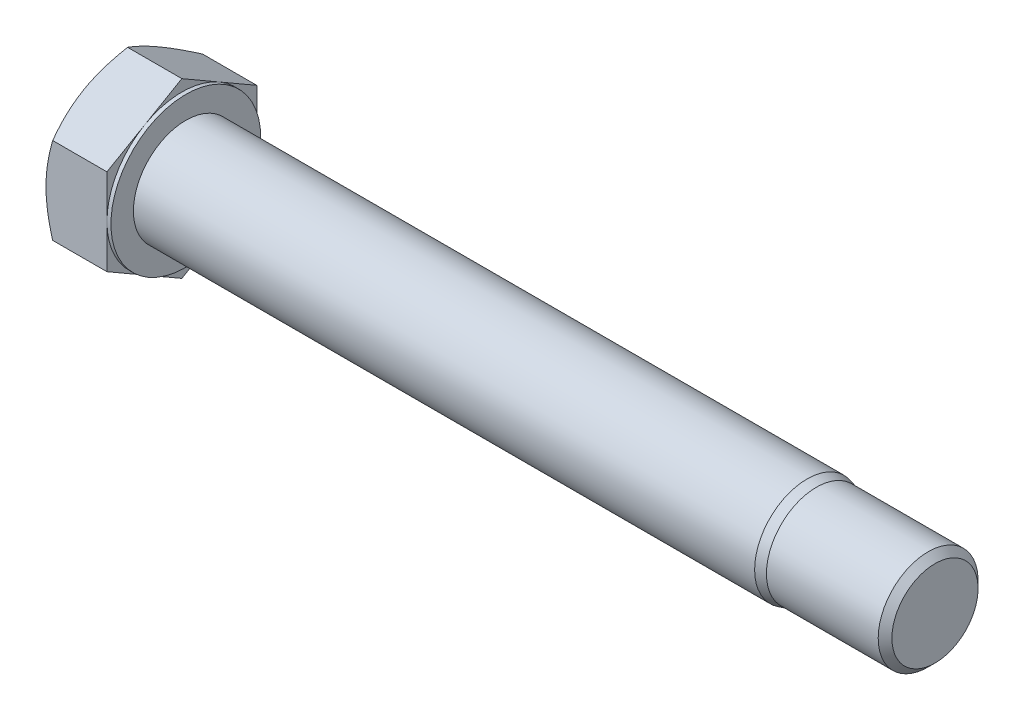
ISO-10303-21;
HEADER;
FILE_DESCRIPTION(('STEP AP214'),'2;1');
FILE_NAME('part.step','',(''),(''),'','','');
FILE_SCHEMA(('AUTOMOTIVE_DESIGN { 1 0 10303 214 1 1 1 1 }'));
ENDSEC;
DATA;
#1=APPLICATION_CONTEXT('core data for automotive mechanical design processes');
#2=APPLICATION_PROTOCOL_DEFINITION('international standard','automotive_design',2000,#1);
#3=PRODUCT_CONTEXT('',#1,'mechanical');
#4=PRODUCT('Part','Part','',(#3));
#5=PRODUCT_RELATED_PRODUCT_CATEGORY('part','',(#4));
#6=PRODUCT_DEFINITION_FORMATION('','',#4);
#7=PRODUCT_DEFINITION_CONTEXT('part definition',#1,'design');
#8=PRODUCT_DEFINITION('design','',#6,#7);
#9=PRODUCT_DEFINITION_SHAPE('','',#8);
#10=(LENGTH_UNIT() NAMED_UNIT(*) SI_UNIT(.MILLI.,.METRE.));
#11=(NAMED_UNIT(*) PLANE_ANGLE_UNIT() SI_UNIT($,.RADIAN.));
#12=(NAMED_UNIT(*) SI_UNIT($,.STERADIAN.) SOLID_ANGLE_UNIT());
#13=UNCERTAINTY_MEASURE_WITH_UNIT(LENGTH_MEASURE(1.E-05),#10,'distance_accuracy_value','');
#14=(GEOMETRIC_REPRESENTATION_CONTEXT(3) GLOBAL_UNCERTAINTY_ASSIGNED_CONTEXT((#13)) GLOBAL_UNIT_ASSIGNED_CONTEXT((#10,
#11,#12)) REPRESENTATION_CONTEXT('',''));
#15=CARTESIAN_POINT('',(0.,0.,0.));
#16=DIRECTION('',(0.,0.,1.));
#17=DIRECTION('',(1.,0.,0.));
#18=AXIS2_PLACEMENT_3D('',#15,#16,#17);
#19=CARTESIAN_POINT('',(13.,17.3205080756888,0.));
#20=DIRECTION('',(1.,0.,0.));
#21=DIRECTION('',(0.,0.,-1.));
#22=AXIS2_PLACEMENT_3D('',#19,#20,#21);
#23=PLANE('',#22);
#24=CARTESIAN_POINT('',(13.,0.,0.));
#25=DIRECTION('',(1.,0.,0.));
#26=DIRECTION('',(0.,0.,-1.));
#27=AXIS2_PLACEMENT_3D('',#24,#25,#26);
#28=CIRCLE('',#27,10.5);
#29=CARTESIAN_POINT('',(13.,0.,-10.5));
#30=VERTEX_POINT('',#29);
#31=EDGE_CURVE('E324',#30,#30,#28,.F.);
#32=ORIENTED_EDGE('',*,*,#31,.T.);
#33=EDGE_LOOP('',(#32));
#34=FACE_BOUND('',#33,.T.);
#35=CARTESIAN_POINT('',(13.,0.,0.));
#36=DIRECTION('',(1.,0.,0.));
#37=DIRECTION('',(0.,0.,-1.));
#38=AXIS2_PLACEMENT_3D('',#35,#36,#37);
#39=CIRCLE('',#38,15.);
#40=CARTESIAN_POINT('',(13.,0.,-15.));
#41=VERTEX_POINT('',#40);
#42=EDGE_CURVE('E337',#41,#41,#39,.T.);
#43=ORIENTED_EDGE('',*,*,#42,.T.);
#44=EDGE_LOOP('',(#43));
#45=FACE_BOUND('',#44,.T.);
#46=ADVANCED_FACE('F32',(#34,#45),#23,.T.);
#47=CARTESIAN_POINT('',(0.,0.,0.));
#48=DIRECTION('',(-1.,0.,0.));
#49=DIRECTION('',(0.,0.,1.));
#50=AXIS2_PLACEMENT_3D('',#47,#48,#49);
#51=CYLINDRICAL_SURFACE('',#50,10.5);
#52=ORIENTED_EDGE('',*,*,#31,.F.);
#53=EDGE_LOOP('',(#52));
#54=FACE_BOUND('',#53,.T.);
#55=CARTESIAN_POINT('',(137.383974596215,0.,0.));
#56=DIRECTION('',(-1.,0.,0.));
#57=DIRECTION('',(0.,0.,1.));
#58=AXIS2_PLACEMENT_3D('',#55,#56,#57);
#59=CIRCLE('',#58,10.5);
#60=CARTESIAN_POINT('',(137.383974596215,0.,10.5));
#61=VERTEX_POINT('',#60);
#62=EDGE_CURVE('E327',#61,#61,#59,.T.);
#63=ORIENTED_EDGE('',*,*,#62,.T.);
#64=EDGE_LOOP('',(#63));
#65=FACE_BOUND('',#64,.T.);
#66=ADVANCED_FACE('F241',(#54,#65),#51,.T.);
#67=CARTESIAN_POINT('',(139.25,0.,0.));
#68=DIRECTION('',(-1.,0.,0.));
#69=DIRECTION('',(0.,0.,1.));
#70=AXIS2_PLACEMENT_3D('',#67,#68,#69);
#71=CONICAL_SURFACE('',#70,9.99999999999999,0.261799387799145);
#72=ORIENTED_EDGE('',*,*,#62,.F.);
#73=EDGE_LOOP('',(#72));
#74=FACE_BOUND('',#73,.T.);
#75=CARTESIAN_POINT('',(139.25,0.,0.));
#76=DIRECTION('',(-1.,0.,0.));
#77=DIRECTION('',(0.,0.,1.));
#78=AXIS2_PLACEMENT_3D('',#75,#76,#77);
#79=CIRCLE('',#78,9.99999999999999);
#80=CARTESIAN_POINT('',(139.25,0.,9.99999999999999));
#81=VERTEX_POINT('',#80);
#82=EDGE_CURVE('E276',#81,#81,#79,.T.);
#83=ORIENTED_EDGE('',*,*,#82,.T.);
#84=EDGE_LOOP('',(#83));
#85=FACE_BOUND('',#84,.T.);
#86=ADVANCED_FACE('F246',(#74,#85),#71,.T.);
#87=CARTESIAN_POINT('',(0.,0.,0.));
#88=DIRECTION('',(-1.,0.,0.));
#89=DIRECTION('',(0.,0.,1.));
#90=AXIS2_PLACEMENT_3D('',#87,#88,#89);
#91=CYLINDRICAL_SURFACE('',#90,10.);
#92=ORIENTED_EDGE('',*,*,#82,.F.);
#93=EDGE_LOOP('',(#92));
#94=FACE_BOUND('',#93,.T.);
#95=CARTESIAN_POINT('',(161.626,0.,0.));
#96=DIRECTION('',(-1.,0.,0.));
#97=DIRECTION('',(0.,0.,1.));
#98=AXIS2_PLACEMENT_3D('',#95,#96,#97);
#99=CIRCLE('',#98,10.0000000000001);
#100=CARTESIAN_POINT('',(161.626,0.,10.0000000000001));
#101=VERTEX_POINT('',#100);
#102=EDGE_CURVE('E274',#101,#101,#99,.T.);
#103=ORIENTED_EDGE('',*,*,#102,.T.);
#104=EDGE_LOOP('',(#103));
#105=FACE_BOUND('',#104,.T.);
#106=ADVANCED_FACE('F254',(#94,#105),#91,.T.);
#107=CARTESIAN_POINT('',(163.,0.,0.));
#108=DIRECTION('',(-1.,0.,0.));
#109=DIRECTION('',(0.,0.,1.));
#110=AXIS2_PLACEMENT_3D('',#107,#108,#109);
#111=CONICAL_SURFACE('',#110,8.626,0.785398163397474);
#112=ORIENTED_EDGE('',*,*,#102,.F.);
#113=EDGE_LOOP('',(#112));
#114=FACE_BOUND('',#113,.T.);
#115=CARTESIAN_POINT('',(163.,0.,0.));
#116=DIRECTION('',(-1.,0.,0.));
#117=DIRECTION('',(0.,0.,1.));
#118=AXIS2_PLACEMENT_3D('',#115,#116,#117);
#119=CIRCLE('',#118,8.626);
#120=CARTESIAN_POINT('',(163.,0.,8.626));
#121=VERTEX_POINT('',#120);
#122=EDGE_CURVE('E228',#121,#121,#119,.T.);
#123=ORIENTED_EDGE('',*,*,#122,.T.);
#124=EDGE_LOOP('',(#123));
#125=FACE_BOUND('',#124,.T.);
#126=ADVANCED_FACE('F258',(#114,#125),#111,.T.);
#127=CARTESIAN_POINT('',(163.,0.,0.));
#128=DIRECTION('',(-1.,0.,0.));
#129=DIRECTION('',(0.,0.,1.));
#130=AXIS2_PLACEMENT_3D('',#127,#128,#129);
#131=PLANE('',#130);
#132=ORIENTED_EDGE('',*,*,#122,.F.);
#133=EDGE_LOOP('',(#132));
#134=FACE_BOUND('',#133,.T.);
#135=ADVANCED_FACE('F261',(#134),#131,.F.);
#136=CARTESIAN_POINT('',(12.2,15.,0.));
#137=DIRECTION('',(1.,0.,0.));
#138=DIRECTION('',(0.,0.,-1.));
#139=AXIS2_PLACEMENT_3D('',#136,#137,#138);
#140=PLANE('',#139);
#141=DIRECTION('',(0.,0.500000000000001,0.866025403784438));
#142=VECTOR('',#141,1.);
#143=CARTESIAN_POINT('',(12.2,8.66025403784438,-15.));
#144=LINE('',#143,#142);
#145=CARTESIAN_POINT('',(12.2,8.66025403784441,-15.));
#146=VERTEX_POINT('',#145);
#147=CARTESIAN_POINT('',(12.2,12.9903810567666,-7.50000000000002));
#148=VERTEX_POINT('',#147);
#149=EDGE_CURVE('E165',#146,#148,#144,.T.);
#150=ORIENTED_EDGE('',*,*,#149,.T.);
#151=CARTESIAN_POINT('',(12.2,0.,0.));
#152=DIRECTION('',(-1.,0.,0.));
#153=DIRECTION('',(0.,0.,1.));
#154=AXIS2_PLACEMENT_3D('',#151,#152,#153);
#155=CIRCLE('',#154,15.);
#156=CARTESIAN_POINT('',(12.2,0.,-15.));
#157=VERTEX_POINT('',#156);
#158=EDGE_CURVE('E48',#148,#157,#155,.T.);
#159=ORIENTED_EDGE('',*,*,#158,.T.);
#160=DIRECTION('',(0.,1.,0.));
#161=VECTOR('',#160,1.);
#162=CARTESIAN_POINT('',(12.2,8.66025403784438,-15.));
#163=LINE('',#162,#161);
#164=EDGE_CURVE('E37',#157,#146,#163,.T.);
#165=ORIENTED_EDGE('',*,*,#164,.T.);
#166=EDGE_LOOP('',(#150,#159,#165));
#167=FACE_BOUND('',#166,.T.);
#168=ADVANCED_FACE('F264',(#167),#140,.T.);
#169=CARTESIAN_POINT('',(12.2,17.3205080756888,0.));
#170=VERTEX_POINT('',#169);
#171=EDGE_CURVE('E163',#148,#170,#144,.T.);
#172=ORIENTED_EDGE('',*,*,#171,.T.);
#173=DIRECTION('',(0.,-0.500000000000001,0.866025403784438));
#174=VECTOR('',#173,1.);
#175=CARTESIAN_POINT('',(12.2,17.3205080756888,0.));
#176=LINE('',#175,#174);
#177=CARTESIAN_POINT('',(12.2,12.9903810567666,7.50000000000002));
#178=VERTEX_POINT('',#177);
#179=EDGE_CURVE('E162',#170,#178,#176,.T.);
#180=ORIENTED_EDGE('',*,*,#179,.T.);
#181=EDGE_CURVE('E151',#178,#148,#155,.T.);
#182=ORIENTED_EDGE('',*,*,#181,.T.);
#183=EDGE_LOOP('',(#172,#180,#182));
#184=FACE_BOUND('',#183,.T.);
#185=ADVANCED_FACE('F269',(#184),#140,.T.);
#186=CARTESIAN_POINT('',(12.2,8.66025403784441,15.));
#187=VERTEX_POINT('',#186);
#188=EDGE_CURVE('E130',#178,#187,#176,.T.);
#189=ORIENTED_EDGE('',*,*,#188,.T.);
#190=DIRECTION('',(0.,-1.,0.));
#191=VECTOR('',#190,1.);
#192=CARTESIAN_POINT('',(12.2,8.66025403784437,15.));
#193=LINE('',#192,#191);
#194=CARTESIAN_POINT('',(12.2,0.,15.));
#195=VERTEX_POINT('',#194);
#196=EDGE_CURVE('E124',#187,#195,#193,.T.);
#197=ORIENTED_EDGE('',*,*,#196,.T.);
#198=EDGE_CURVE('E128',#195,#178,#155,.T.);
#199=ORIENTED_EDGE('',*,*,#198,.T.);
#200=EDGE_LOOP('',(#189,#197,#199));
#201=FACE_BOUND('',#200,.T.);
#202=ADVANCED_FACE('F126',(#201),#140,.T.);
#203=CARTESIAN_POINT('',(12.2,-8.6602540378444,15.));
#204=VERTEX_POINT('',#203);
#205=EDGE_CURVE('E134',#195,#204,#193,.T.);
#206=ORIENTED_EDGE('',*,*,#205,.T.);
#207=DIRECTION('',(0.,-0.500000000000001,-0.866025403784438));
#208=VECTOR('',#207,1.);
#209=CARTESIAN_POINT('',(12.2,-17.3205080756888,0.));
#210=LINE('',#209,#208);
#211=CARTESIAN_POINT('',(12.2,-12.9903810567666,7.50000000000002));
#212=VERTEX_POINT('',#211);
#213=EDGE_CURVE('E141',#204,#212,#210,.T.);
#214=ORIENTED_EDGE('',*,*,#213,.T.);
#215=EDGE_CURVE('E138',#212,#195,#155,.T.);
#216=ORIENTED_EDGE('',*,*,#215,.T.);
#217=EDGE_LOOP('',(#206,#214,#216));
#218=FACE_BOUND('',#217,.T.);
#219=ADVANCED_FACE('F139',(#218),#140,.T.);
#220=CARTESIAN_POINT('',(12.2,-17.3205080756888,0.));
#221=VERTEX_POINT('',#220);
#222=EDGE_CURVE('E157',#212,#221,#210,.T.);
#223=ORIENTED_EDGE('',*,*,#222,.T.);
#224=DIRECTION('',(0.,0.5,-0.866025403784438));
#225=VECTOR('',#224,1.);
#226=CARTESIAN_POINT('',(12.2,-8.66025403784441,-15.));
#227=LINE('',#226,#225);
#228=CARTESIAN_POINT('',(12.2,-12.9903810567666,-7.50000000000001));
#229=VERTEX_POINT('',#228);
#230=EDGE_CURVE('E350',#221,#229,#227,.T.);
#231=ORIENTED_EDGE('',*,*,#230,.T.);
#232=EDGE_CURVE('E145',#229,#212,#155,.T.);
#233=ORIENTED_EDGE('',*,*,#232,.T.);
#234=EDGE_LOOP('',(#223,#231,#233));
#235=FACE_BOUND('',#234,.T.);
#236=ADVANCED_FACE('F352',(#235),#140,.T.);
#237=CARTESIAN_POINT('',(12.2,-8.6602540378444,-15.));
#238=VERTEX_POINT('',#237);
#239=EDGE_CURVE('E152',#229,#238,#227,.T.);
#240=ORIENTED_EDGE('',*,*,#239,.T.);
#241=EDGE_CURVE('E11',#238,#157,#163,.T.);
#242=ORIENTED_EDGE('',*,*,#241,.T.);
#243=EDGE_CURVE('E349',#157,#229,#155,.T.);
#244=ORIENTED_EDGE('',*,*,#243,.T.);
#245=EDGE_LOOP('',(#240,#242,#244));
#246=FACE_BOUND('',#245,.T.);
#247=ADVANCED_FACE('F270',(#246),#140,.T.);
#248=CARTESIAN_POINT('',(0.,0.,0.));
#249=DIRECTION('',(-1.,0.,0.));
#250=DIRECTION('',(0.,0.,1.));
#251=AXIS2_PLACEMENT_3D('',#248,#249,#250);
#252=CYLINDRICAL_SURFACE('',#251,15.);
#253=ORIENTED_EDGE('',*,*,#158,.F.);
#254=ORIENTED_EDGE('',*,*,#181,.F.);
#255=ORIENTED_EDGE('',*,*,#198,.F.);
#256=ORIENTED_EDGE('',*,*,#215,.F.);
#257=ORIENTED_EDGE('',*,*,#232,.F.);
#258=ORIENTED_EDGE('',*,*,#243,.F.);
#259=EDGE_LOOP('',(#253,#254,#255,#256,#257,#258));
#260=FACE_BOUND('',#259,.T.);
#261=ORIENTED_EDGE('',*,*,#42,.F.);
#262=EDGE_LOOP('',(#261));
#263=FACE_BOUND('',#262,.T.);
#264=ADVANCED_FACE('F148',(#260,#263),#252,.T.);
#265=CARTESIAN_POINT('',(0.,17.3205080756888,0.));
#266=DIRECTION('',(1.,0.,0.));
#267=DIRECTION('',(0.,0.,-1.));
#268=AXIS2_PLACEMENT_3D('',#265,#266,#267);
#269=PLANE('',#268);
#270=CARTESIAN_POINT('',(0.,0.,0.));
#271=DIRECTION('',(1.,0.,0.));
#272=DIRECTION('',(0.,0.,-1.));
#273=AXIS2_PLACEMENT_3D('',#270,#271,#272);
#274=CIRCLE('',#273,15.);
#275=CARTESIAN_POINT('',(0.,0.,-15.));
#276=VERTEX_POINT('',#275);
#277=CARTESIAN_POINT('',(0.,12.9903810567666,-7.50000000000001));
#278=VERTEX_POINT('',#277);
#279=EDGE_CURVE('E336',#276,#278,#274,.T.);
#280=ORIENTED_EDGE('',*,*,#279,.F.);
#281=CARTESIAN_POINT('',(0.,-12.9903810567666,-7.50000000000002));
#282=VERTEX_POINT('',#281);
#283=EDGE_CURVE('E335',#282,#276,#274,.T.);
#284=ORIENTED_EDGE('',*,*,#283,.F.);
#285=CARTESIAN_POINT('',(0.,-12.9903810567666,7.50000000000003));
#286=VERTEX_POINT('',#285);
#287=EDGE_CURVE('E294',#286,#282,#274,.T.);
#288=ORIENTED_EDGE('',*,*,#287,.F.);
#289=CARTESIAN_POINT('',(0.,0.,15.));
#290=VERTEX_POINT('',#289);
#291=EDGE_CURVE('E304',#290,#286,#274,.T.);
#292=ORIENTED_EDGE('',*,*,#291,.F.);
#293=CARTESIAN_POINT('',(0.,12.9903810567666,7.50000000000002));
#294=VERTEX_POINT('',#293);
#295=EDGE_CURVE('E312',#294,#290,#274,.T.);
#296=ORIENTED_EDGE('',*,*,#295,.F.);
#297=EDGE_CURVE('E317',#278,#294,#274,.T.);
#298=ORIENTED_EDGE('',*,*,#297,.F.);
#299=EDGE_LOOP('',(#280,#284,#288,#292,#296,#298));
#300=FACE_BOUND('',#299,.T.);
#301=ADVANCED_FACE('F192',(#300),#269,.F.);
#302=CARTESIAN_POINT('',(-3.75000000000003,0.,0.));
#303=DIRECTION('',(1.,0.,0.));
#304=DIRECTION('',(0.,0.,-1.));
#305=AXIS2_PLACEMENT_3D('',#302,#303,#304);
#306=CONICAL_SURFACE('',#305,8.50480947161672,1.04719755119659);
#307=CARTESIAN_POINT('',(1.33981262948896,17.3206235457426,0.0002));
#308=CARTESIAN_POINT('',(1.22992178974396,17.130274565913,-0.329494104233799));
#309=CARTESIAN_POINT('',(1.12501758932863,16.939183122782,-0.6604741926283));
#310=CARTESIAN_POINT('',(0.926568581943121,16.5554679079492,-1.32508844035602));
#311=CARTESIAN_POINT('',(0.83302751104951,16.3628436543362,-1.6587234343838));
#312=CARTESIAN_POINT('',(0.658562147609874,15.9756905506624,-2.32929228025473));
#313=CARTESIAN_POINT('',(0.5776677066022,15.7811583127512,-2.66623200002702));
#314=CARTESIAN_POINT('',(0.430232643422054,15.3907420734253,-3.34245276263939));
#315=CARTESIAN_POINT('',(0.363691202381335,15.1948581497855,-3.68173367076952));
#316=CARTESIAN_POINT('',(0.247792374696316,14.8067578304067,-4.35394314236732));
#317=CARTESIAN_POINT('',(0.198051383436672,14.6145702475688,-4.68682180042635));
#318=CARTESIAN_POINT('',(0.114646749003612,14.2293144416655,-5.3541044301617));
#319=CARTESIAN_POINT('',(0.0809834152900895,14.0362462017216,-5.6885084310725));
#320=CARTESIAN_POINT('',(0.0305840757080864,13.6497853945792,-6.35787818417716));
#321=CARTESIAN_POINT('',(0.0138279549580525,13.4563934876199,-6.69284279280336));
#322=CARTESIAN_POINT('',(-0.00239660617302037,13.0694311550724,-7.36308121339102));
#323=CARTESIAN_POINT('',(-0.00186558072757846,12.8758607351851,-7.69835501547826));
#324=CARTESIAN_POINT('',(0.015276612998169,12.5139822792559,-8.32514688731222));
#325=CARTESIAN_POINT('',(0.0297968460490158,12.3456484541475,-8.61670962503244));
#326=CARTESIAN_POINT('',(0.0716371404224131,12.0093680110861,-9.19916443800649));
#327=CARTESIAN_POINT('',(0.0989581071094781,11.8414214213658,-9.4900564643599));
#328=CARTESIAN_POINT('',(0.165923511998908,11.5060066717823,-10.0710118522466));
#329=CARTESIAN_POINT('',(0.205578128270666,11.338539022767,-10.3610743289652));
#330=CARTESIAN_POINT('',(0.296515103017909,11.0043888432043,-10.939839417326));
#331=CARTESIAN_POINT('',(0.347798251969264,10.8377063668174,-11.2285419351595));
#332=CARTESIAN_POINT('',(0.520386864747116,10.3317324659531,-12.1049144387604));
#333=CARTESIAN_POINT('',(0.658901178256939,9.99390625559024,-12.6900465992373));
#334=CARTESIAN_POINT('',(0.973271968475223,9.32329122184509,-13.8515859100034));
#335=CARTESIAN_POINT('',(1.14905461461789,8.99049381241394,-14.4280079317654));
#336=CARTESIAN_POINT('',(1.33981262948895,8.66013856779054,-15.0002));
#337=B_SPLINE_CURVE_WITH_KNOTS('',3,(#307,#308,#309,#310,#311,#312,#313,#314,#315,#316,#317,
#318,#319,#320,#321,#322,#323,#324,#325,#326,#327,#328,#329,#330,#331,#332,#333,#334,#335,#336),
.UNSPECIFIED.,.F.,.F.,(4,2,2,2,2,2,2,2,2,2,2,2,2,2,4),(0.,1.18875411504163,2.37789802800057,
3.56980778300396,4.76164951910137,5.9240737968376,7.08652044780813,8.2475824740608,
9.40860862348379,10.4193068498566,11.4300765712312,12.4416826308653,13.4533574773408,
15.5211962051185,17.5849760846241),.UNSPECIFIED.);
#338=CARTESIAN_POINT('',(1.33974596215563,17.3205080756888,0.));
#339=VERTEX_POINT('',#338);
#340=EDGE_CURVE('E56',#339,#278,#337,.T.);
#341=ORIENTED_EDGE('',*,*,#340,.T.);
#342=ORIENTED_EDGE('',*,*,#297,.T.);
#343=CARTESIAN_POINT('',(1.33981262948895,8.66013856779053,15.0002));
#344=CARTESIAN_POINT('',(1.22992178974395,8.85048754762015,14.6705058957662));
#345=CARTESIAN_POINT('',(1.12501758932862,9.04157899075112,14.3395258073717));
#346=CARTESIAN_POINT('',(0.926568581943112,9.42529420558398,13.674911559644));
#347=CARTESIAN_POINT('',(0.8330275110495,9.617918459197,13.3412765656162));
#348=CARTESIAN_POINT('',(0.658562147609866,10.0050715628708,12.6707077197453));
#349=CARTESIAN_POINT('',(0.577667706602194,10.199603800782,12.333767999973));
#350=CARTESIAN_POINT('',(0.430232643422049,10.5900200401078,11.6575472373606));
#351=CARTESIAN_POINT('',(0.363691202381331,10.7859039637477,11.3182663292305));
#352=CARTESIAN_POINT('',(0.247792374696311,11.1740042831265,10.6460568576327));
#353=CARTESIAN_POINT('',(0.198051383436668,11.3661918659643,10.3131781995737));
#354=CARTESIAN_POINT('',(0.114646749003609,11.7514476718676,9.6458955698383));
#355=CARTESIAN_POINT('',(0.0809834152900879,11.9445159118115,9.3114915689275));
#356=CARTESIAN_POINT('',(0.0305840757080845,12.3309767189539,8.64212181582284));
#357=CARTESIAN_POINT('',(0.0138279549580492,12.5243686259132,8.30715720719664));
#358=CARTESIAN_POINT('',(-0.00239660617302328,12.9113309584608,7.63691878660899));
#359=CARTESIAN_POINT('',(-0.00186558072757963,13.1049013783481,7.30164498452175));
#360=CARTESIAN_POINT('',(0.0152766129981692,13.4667798342773,6.67485311268779));
#361=CARTESIAN_POINT('',(0.029796846049016,13.6351136593857,6.38329037496757));
#362=CARTESIAN_POINT('',(0.0716371404224139,13.9713941024471,5.80083556199351));
#363=CARTESIAN_POINT('',(0.0989581071094796,14.1393406921673,5.5099435356401));
#364=CARTESIAN_POINT('',(0.16592351199891,14.4747554417509,4.92898814775337));
#365=CARTESIAN_POINT('',(0.205578128270668,14.6422230907662,4.63892567103481));
#366=CARTESIAN_POINT('',(0.296515103017912,14.9763732703289,4.06016058267396));
#367=CARTESIAN_POINT('',(0.347798251969267,15.1430557467158,3.77145806484046));
#368=CARTESIAN_POINT('',(0.52038686474712,15.6490296475801,2.89508556123959));
#369=CARTESIAN_POINT('',(0.658901178256944,15.9868558579429,2.30995340076274));
#370=CARTESIAN_POINT('',(0.973271968475231,16.6574708916881,1.14841408999664));
#371=CARTESIAN_POINT('',(1.1490546146179,16.9902683011192,0.571992068234583));
#372=CARTESIAN_POINT('',(1.33981262948896,17.3206235457426,-0.000200000000000835));
#373=B_SPLINE_CURVE_WITH_KNOTS('',3,(#343,#344,#345,#346,#347,#348,#349,#350,#351,#352,#353,
#354,#355,#356,#357,#358,#359,#360,#361,#362,#363,#364,#365,#366,#367,#368,#369,#370,#371,#372),
.UNSPECIFIED.,.F.,.F.,(4,2,2,2,2,2,2,2,2,2,2,2,2,2,4),(0.,1.18875411504163,2.37789802800057,
3.56980778300395,4.76164951910137,5.92407379683759,7.08652044780813,8.24758247406079,
9.40860862348378,10.4193068498566,11.4300765712312,12.4416826308653,13.4533574773408,
15.5211962051185,17.5849760846241),.UNSPECIFIED.);
#374=EDGE_CURVE('E227',#294,#339,#373,.T.);
#375=ORIENTED_EDGE('',*,*,#374,.T.);
#376=EDGE_LOOP('',(#341,#342,#375));
#377=FACE_BOUND('',#376,.T.);
#378=ADVANCED_FACE('F181',(#377),#306,.T.);
#379=CARTESIAN_POINT('',(1.33974596215562,8.66025403784437,15.));
#380=VERTEX_POINT('',#379);
#381=EDGE_CURVE('E222',#380,#294,#373,.T.);
#382=ORIENTED_EDGE('',*,*,#381,.T.);
#383=ORIENTED_EDGE('',*,*,#295,.T.);
#384=CARTESIAN_POINT('',(7.34067071515347,-23.3042652502346,15.));
#385=CARTESIAN_POINT('',(7.18156779867757,-22.9765341561843,15.));
#386=CARTESIAN_POINT('',(7.02325509780224,-22.648419619423,15.));
#387=CARTESIAN_POINT('',(6.70838900944482,-21.9913436592706,15.));
#388=CARTESIAN_POINT('',(6.55183563953038,-21.6623822274633,15.));
#389=CARTESIAN_POINT('',(6.08504186446728,-20.6740205756075,15.));
#390=CARTESIAN_POINT('',(5.77771466676506,-20.013239287009,15.));
#391=CARTESIAN_POINT('',(5.17103347366634,-18.6836927165475,15.));
#392=CARTESIAN_POINT('',(4.8717316328571,-18.0149035792745,15.));
#393=CARTESIAN_POINT('',(4.28531537205747,-16.672021466831,15.));
#394=CARTESIAN_POINT('',(3.99820037915417,-15.997928742756,15.));
#395=CARTESIAN_POINT('',(3.43032614621726,-14.6214178954332,15.));
#396=CARTESIAN_POINT('',(3.15007396164642,-13.9187894970855,15.));
#397=CARTESIAN_POINT('',(2.61067811288135,-12.5053227943984,15.));
#398=CARTESIAN_POINT('',(2.35153681205786,-11.7944835809986,15.));
#399=CARTESIAN_POINT('',(1.86113921287669,-10.3648046207861,15.));
#400=CARTESIAN_POINT('',(1.62982681897164,-9.64598427064374,15.));
#401=CARTESIAN_POINT('',(1.2024688444707,-8.1979641694678,15.));
#402=CARTESIAN_POINT('',(1.00641219949375,-7.4687677525739,15.));
#403=CARTESIAN_POINT('',(0.74638148954881,-6.36908708426342,15.));
#404=CARTESIAN_POINT('',(0.665556542332853,-6.00256349464106,15.));
#405=CARTESIAN_POINT('',(0.516215906279781,-5.26700410132772,15.));
#406=CARTESIAN_POINT('',(0.447699966240373,-4.89796834906453,15.));
#407=CARTESIAN_POINT('',(0.324184020148006,-4.1576349881433,15.));
#408=CARTESIAN_POINT('',(0.269183850795453,-3.78633740686857,15.));
#409=CARTESIAN_POINT('',(0.17379552048681,-3.04187310827176,15.));
#410=CARTESIAN_POINT('',(0.133406727499754,-2.66870647250577,15.));
#411=CARTESIAN_POINT('',(0.0685517789539619,-1.92591313748793,15.));
#412=CARTESIAN_POINT('',(0.0438838189783453,-1.55630416674746,15.));
#413=CARTESIAN_POINT('',(0.0102026402602086,-0.816374859116383,15.));
#414=CARTESIAN_POINT('',(0.00118916075528595,-0.446054534177941,15.));
#415=CARTESIAN_POINT('',(-0.000968542023530105,0.294636183080755,15.));
#416=CARTESIAN_POINT('',(0.0058872977333575,0.665006575594028,15.));
#417=CARTESIAN_POINT('',(0.0353005369749877,1.40512739642794,15.));
#418=CARTESIAN_POINT('',(0.0578586405592746,1.77487779620241,15.));
#419=CARTESIAN_POINT('',(0.130359529520866,2.66225131615495,15.));
#420=CARTESIAN_POINT('',(0.187682894452928,3.17928211157757,15.));
#421=CARTESIAN_POINT('',(0.329920354848767,4.20953694220725,15.));
#422=CARTESIAN_POINT('',(0.414838167720421,4.7227604549798,15.));
#423=CARTESIAN_POINT('',(0.609243756551085,5.74490151650208,15.));
#424=CARTESIAN_POINT('',(0.718750596562518,6.25381540456153,15.));
#425=CARTESIAN_POINT('',(0.958990010594618,7.26655289822437,15.));
#426=CARTESIAN_POINT('',(1.0897222713676,7.77037657883321,15.));
#427=CARTESIAN_POINT('',(1.37231868690396,8.78401362845178,15.));
#428=CARTESIAN_POINT('',(1.52458533942788,9.29371400216383,15.));
#429=CARTESIAN_POINT('',(1.84492743287876,10.3080942836651,15.));
#430=CARTESIAN_POINT('',(2.01300297781562,10.8127741583993,15.));
#431=CARTESIAN_POINT('',(2.36228753701364,11.8173612741181,15.));
#432=CARTESIAN_POINT('',(2.5434922271318,12.3172700256551,15.));
#433=CARTESIAN_POINT('',(2.91689581252831,13.3129403414726,15.));
#434=CARTESIAN_POINT('',(3.10909458126463,13.8087019534115,15.));
#435=CARTESIAN_POINT('',(3.57360485355449,14.9746038035992,15.));
#436=CARTESIAN_POINT('',(3.84982124497853,15.6431858961613,15.));
#437=CARTESIAN_POINT('',(4.41563784259355,16.9746795615835,15.));
#438=CARTESIAN_POINT('',(4.70523886905363,17.6375907839497,15.));
#439=CARTESIAN_POINT('',(5.29515643160973,18.9587926969958,15.));
#440=CARTESIAN_POINT('',(5.59547534200811,19.6170823247283,15.));
#441=CARTESIAN_POINT('',(6.20467573064066,20.9296606727678,15.));
#442=CARTESIAN_POINT('',(6.51355702718966,21.5839494776094,15.));
#443=CARTESIAN_POINT('',(7.13862847265525,22.8898994902307,15.));
#444=CARTESIAN_POINT('',(7.45482623896846,23.5415570457315,15.));
#445=CARTESIAN_POINT('',(8.09295875416608,24.8420565829957,15.));
#446=CARTESIAN_POINT('',(8.41489352757081,25.4908985527103,15.));
#447=CARTESIAN_POINT('',(9.0634781977951,26.7861146196968,15.));
#448=CARTESIAN_POINT('',(9.39012748233847,27.432489023888,15.));
#449=CARTESIAN_POINT('',(10.0474129227363,28.7232086776039,15.));
#450=CARTESIAN_POINT('',(10.3780490943187,29.3675539191109,15.));
#451=CARTESIAN_POINT('',(11.3194716957165,31.1905009177913,15.));
#452=CARTESIAN_POINT('',(11.9342118225534,32.367060839785,15.));
#453=CARTESIAN_POINT('',(13.1721121262381,34.7157851558137,15.));
#454=CARTESIAN_POINT('',(13.7952725995008,35.8879493932454,15.));
#455=CARTESIAN_POINT('',(15.0464839728173,38.2259091871194,15.));
#456=CARTESIAN_POINT('',(15.6745188321177,39.3917133340375,15.));
#457=CARTESIAN_POINT('',(16.6203232909783,41.1383439953252,15.));
#458=CARTESIAN_POINT('',(16.9362082187349,41.720192593989,15.));
#459=CARTESIAN_POINT('',(17.5691038731807,42.8832760591035,15.));
#460=CARTESIAN_POINT('',(17.886114598108,43.4645109265128,15.));
#461=CARTESIAN_POINT('',(18.2036234821096,44.0454736178559,15.));
#462=B_SPLINE_CURVE_WITH_KNOTS('',3,(#384,#385,#386,#387,#388,#389,#390,#391,#392,#393,#394,
#395,#396,#397,#398,#399,#400,#401,#402,#403,#404,#405,#406,#407,#408,#409,#410,#411,#412,#413,
#414,#415,#416,#417,#418,#419,#420,#421,#422,#423,#424,#425,#426,#427,#428,#429,#430,#431,#432,
#433,#434,#435,#436,#437,#438,#439,#440,#441,#442,#443,#444,#445,#446,#447,#448,#449,#450,#451,
#452,#453,#454,#455,#456,#457,#458,#459,#460,#461),.UNSPECIFIED.,.F.,.F.,(4,2,2,2,2,2,2,2,2,2,2,
2,2,2,2,2,2,2,2,2,2,2,2,2,2,2,2,2,2,2,2,2,2,2,2,2,2,2,4),(0.,1.0929265174083,2.18586393846466,
4.37206003457368,6.5700882266555,8.76801297307204,11.037126459905,13.3064936266831,
15.5712068703933,17.8352081295548,18.9610232976559,20.0868154875035,21.2125940746903,
22.3383239592763,23.4492954988051,24.5602485322974,25.6712059783519,26.7822132436575,
28.3419475576269,29.9018920796078,31.4630502397375,33.0241853621739,34.6197538618724,
36.2153328598742,37.8103887148468,39.4054262143923,41.5754079616112,43.7455228716223,
45.9161215420533,48.0866741897833,50.2595985401339,52.4325321799328,54.6051861145462,
56.7778486229257,60.7602319673313,64.7427558676026,68.715363316539,70.7015596979606,
72.6877529724688),.UNSPECIFIED.);
#463=EDGE_CURVE('E221',#290,#380,#462,.T.);
#464=ORIENTED_EDGE('',*,*,#463,.T.);
#465=EDGE_LOOP('',(#382,#383,#464));
#466=FACE_BOUND('',#465,.T.);
#467=ADVANCED_FACE('F310',(#466),#306,.T.);
#468=CARTESIAN_POINT('',(1.33974596215563,-8.6602540378444,15.));
#469=VERTEX_POINT('',#468);
#470=EDGE_CURVE('E216',#469,#290,#462,.T.);
#471=ORIENTED_EDGE('',*,*,#470,.T.);
#472=ORIENTED_EDGE('',*,*,#291,.T.);
#473=CARTESIAN_POINT('',(1.33981262948898,-17.3206235457426,-0.000200000000000114));
#474=CARTESIAN_POINT('',(1.22992178974397,-17.130274565913,0.3294941042338));
#475=CARTESIAN_POINT('',(1.12501758932865,-16.9391831227821,0.660474192628301));
#476=CARTESIAN_POINT('',(0.926568581943134,-16.5554679079492,1.32508844035602));
#477=CARTESIAN_POINT('',(0.833027511049523,-16.3628436543362,1.65872343438381));
#478=CARTESIAN_POINT('',(0.658562147609887,-15.9756905506624,2.32929228025473));
#479=CARTESIAN_POINT('',(0.577667706602213,-15.7811583127512,2.66623200002702));
#480=CARTESIAN_POINT('',(0.430232643422067,-15.3907420734253,3.34245276263939));
#481=CARTESIAN_POINT('',(0.363691202381348,-15.1948581497855,3.68173367076952));
#482=CARTESIAN_POINT('',(0.247792374696327,-14.8067578304067,4.35394314236733));
#483=CARTESIAN_POINT('',(0.198051383436683,-14.6145702475688,4.68682180042635));
#484=CARTESIAN_POINT('',(0.114646749003623,-14.2293144416656,5.35410443016171));
#485=CARTESIAN_POINT('',(0.0809834152901018,-14.0362462017216,5.68850843107251));
#486=CARTESIAN_POINT('',(0.0305840757080981,-13.6497853945793,6.35787818417717));
#487=CARTESIAN_POINT('',(0.013827954958063,-13.4563934876199,6.69284279280337));
#488=CARTESIAN_POINT('',(-0.00239660617301029,-13.0694311550724,7.36308121339103));
#489=CARTESIAN_POINT('',(-0.0018655807275675,-12.8758607351851,7.69835501547827));
#490=CARTESIAN_POINT('',(0.0152766129981805,-12.5139822792559,8.32514688731223));
#491=CARTESIAN_POINT('',(0.0297968460490271,-12.3456484541475,8.61670962503245));
#492=CARTESIAN_POINT('',(0.0716371404224234,-12.0093680110861,9.1991644380065));
#493=CARTESIAN_POINT('',(0.0989581071094878,-11.8414214213658,9.49005646435991));
#494=CARTESIAN_POINT('',(0.165923511998917,-11.5060066717823,10.0710118522466));
#495=CARTESIAN_POINT('',(0.205578128270675,-11.338539022767,10.3610743289652));
#496=CARTESIAN_POINT('',(0.296515103017919,-11.0043888432043,10.939839417326));
#497=CARTESIAN_POINT('',(0.347798251969273,-10.8377063668174,11.2285419351595));
#498=CARTESIAN_POINT('',(0.520386864747124,-10.3317324659531,12.1049144387604));
#499=CARTESIAN_POINT('',(0.658901178256947,-9.99390625559026,12.6900465992373));
#500=CARTESIAN_POINT('',(0.973271968475231,-9.32329122184511,13.8515859100034));
#501=CARTESIAN_POINT('',(1.14905461461789,-8.99049381241396,14.4280079317654));
#502=CARTESIAN_POINT('',(1.33981262948896,-8.66013856779056,15.0002));
#503=B_SPLINE_CURVE_WITH_KNOTS('',3,(#473,#474,#475,#476,#477,#478,#479,#480,#481,#482,#483,
#484,#485,#486,#487,#488,#489,#490,#491,#492,#493,#494,#495,#496,#497,#498,#499,#500,#501,#502),
.UNSPECIFIED.,.F.,.F.,(4,2,2,2,2,2,2,2,2,2,2,2,2,2,4),(0.,1.18875411504163,2.37789802800058,
3.56980778300396,4.76164951910138,5.92407379683761,7.08652044780814,8.24758247406082,
9.4086086234838,10.4193068498567,11.4300765712312,12.4416826308653,13.4533574773408,
15.5211962051185,17.5849760846241),.UNSPECIFIED.);
#504=EDGE_CURVE('E210',#286,#469,#503,.T.);
#505=ORIENTED_EDGE('',*,*,#504,.T.);
#506=EDGE_LOOP('',(#471,#472,#505));
#507=FACE_BOUND('',#506,.T.);
#508=ADVANCED_FACE('F301',(#507),#306,.T.);
#509=CARTESIAN_POINT('',(1.33974596215565,-17.3205080756888,0.));
#510=VERTEX_POINT('',#509);
#511=EDGE_CURVE('E205',#510,#286,#503,.T.);
#512=ORIENTED_EDGE('',*,*,#511,.T.);
#513=ORIENTED_EDGE('',*,*,#287,.T.);
#514=CARTESIAN_POINT('',(1.33981262948896,-8.66013856779057,-15.0002));
#515=CARTESIAN_POINT('',(1.22992178974396,-8.85048754762019,-14.6705058957662));
#516=CARTESIAN_POINT('',(1.12501758932863,-9.04157899075116,-14.3395258073717));
#517=CARTESIAN_POINT('',(0.926568581943125,-9.42529420558402,-13.674911559644));
#518=CARTESIAN_POINT('',(0.833027511049514,-9.61791845919704,-13.3412765656162));
#519=CARTESIAN_POINT('',(0.658562147609879,-10.0050715628708,-12.6707077197453));
#520=CARTESIAN_POINT('',(0.577667706602206,-10.199603800782,-12.333767999973));
#521=CARTESIAN_POINT('',(0.430232643422061,-10.5900200401079,-11.6575472373606));
#522=CARTESIAN_POINT('',(0.363691202381343,-10.7859039637477,-11.3182663292305));
#523=CARTESIAN_POINT('',(0.247792374696324,-11.1740042831265,-10.6460568576327));
#524=CARTESIAN_POINT('',(0.198051383436681,-11.3661918659644,-10.3131781995737));
#525=CARTESIAN_POINT('',(0.114646749003622,-11.7514476718676,-9.6458955698383));
#526=CARTESIAN_POINT('',(0.0809834152901012,-11.9445159118116,-9.3114915689275));
#527=CARTESIAN_POINT('',(0.0305840757080991,-12.3309767189539,-8.64212181582284));
#528=CARTESIAN_POINT('',(0.013827954958065,-12.5243686259133,-8.30715720719664));
#529=CARTESIAN_POINT('',(-0.00239660617300691,-12.9113309584608,-7.63691878660898));
#530=CARTESIAN_POINT('',(-0.00186558072756384,-13.1049013783481,-7.30164498452174));
#531=CARTESIAN_POINT('',(0.0152766129981848,-13.4667798342773,-6.67485311268778));
#532=CARTESIAN_POINT('',(0.0297968460490318,-13.6351136593857,-6.38329037496756));
#533=CARTESIAN_POINT('',(0.0716371404224303,-13.9713941024471,-5.8008355619935));
#534=CARTESIAN_POINT('',(0.0989581071094964,-14.1393406921674,-5.5099435356401));
#535=CARTESIAN_POINT('',(0.165923511998926,-14.4747554417509,-4.92898814775336));
#536=CARTESIAN_POINT('',(0.205578128270684,-14.6422230907662,-4.6389256710348));
#537=CARTESIAN_POINT('',(0.296515103017927,-14.9763732703289,-4.06016058267395));
#538=CARTESIAN_POINT('',(0.347798251969283,-15.1430557467158,-3.77145806484046));
#539=CARTESIAN_POINT('',(0.520386864747137,-15.6490296475801,-2.89508556123958));
#540=CARTESIAN_POINT('',(0.658901178256961,-15.9868558579429,-2.30995340076274));
#541=CARTESIAN_POINT('',(0.973271968475246,-16.6574708916881,-1.14841408999663));
#542=CARTESIAN_POINT('',(1.14905461461791,-16.9902683011192,-0.571992068234581));
#543=CARTESIAN_POINT('',(1.33981262948898,-17.3206235457426,0.000200000000002174));
#544=B_SPLINE_CURVE_WITH_KNOTS('',3,(#514,#515,#516,#517,#518,#519,#520,#521,#522,#523,#524,
#525,#526,#527,#528,#529,#530,#531,#532,#533,#534,#535,#536,#537,#538,#539,#540,#541,#542,#543),
.UNSPECIFIED.,.F.,.F.,(4,2,2,2,2,2,2,2,2,2,2,2,2,2,4),(0.,1.18875411504163,2.37789802800057,
3.56980778300396,4.76164951910137,5.9240737968376,7.08652044780813,8.2475824740608,
9.40860862348379,10.4193068498566,11.4300765712312,12.4416826308653,13.4533574773408,
15.5211962051185,17.5849760846241),.UNSPECIFIED.);
#545=EDGE_CURVE('E211',#282,#510,#544,.T.);
#546=ORIENTED_EDGE('',*,*,#545,.T.);
#547=EDGE_LOOP('',(#512,#513,#546));
#548=FACE_BOUND('',#547,.T.);
#549=ADVANCED_FACE('F291',(#548),#306,.T.);
#550=CARTESIAN_POINT('',(7.34067071555581,-23.3042652510633,-15.));
#551=CARTESIAN_POINT('',(7.18156779907149,-22.9765341569991,-15.));
#552=CARTESIAN_POINT('',(7.02325509818775,-22.6484196202239,-15.));
#553=CARTESIAN_POINT('',(6.70838900981353,-21.9913436600437,-15.));
#554=CARTESIAN_POINT('',(6.55183563989069,-21.6623822282224,-15.));
#555=CARTESIAN_POINT('',(6.08504186480243,-20.6740205763248,-15.));
#556=CARTESIAN_POINT('',(5.77771466708347,-20.0132392876983,-15.));
#557=CARTESIAN_POINT('',(5.17103347395127,-18.6836927171804,-15.));
#558=CARTESIAN_POINT('',(4.87173163312528,-18.0149035798791,-15.));
#559=CARTESIAN_POINT('',(4.28531537229243,-16.6720214673786,-15.));
#560=CARTESIAN_POINT('',(3.99820037937266,-15.997928743275,-15.));
#561=CARTESIAN_POINT('',(3.43032614640239,-14.6214178958929,-15.));
#562=CARTESIAN_POINT('',(3.15007396181469,-13.9187894975144,-15.));
#563=CARTESIAN_POINT('',(2.61067811301682,-12.5053227947654,-15.));
#564=CARTESIAN_POINT('',(2.35153681217738,-11.7944835813343,-15.));
#565=CARTESIAN_POINT('',(1.86113921296586,-10.3648046210588,-15.));
#566=CARTESIAN_POINT('',(1.6298268190464,-9.64598427088454,-15.));
#567=CARTESIAN_POINT('',(1.20246884451904,-8.19796416964406,-15.));
#568=CARTESIAN_POINT('',(1.00641219953007,-7.46876775271744,-15.));
#569=CARTESIAN_POINT('',(0.746381489567911,-6.36908708434916,-15.));
#570=CARTESIAN_POINT('',(0.665556542345651,-6.00256349470202,-15.));
#571=CARTESIAN_POINT('',(0.516215906281611,-5.26700410133877,-15.));
#572=CARTESIAN_POINT('',(0.447699966237537,-4.89796834905046,-15.));
#573=CARTESIAN_POINT('',(0.324184020137724,-4.1576349880787,-15.));
#574=CARTESIAN_POINT('',(0.269183850782392,-3.78633740677858,-15.));
#575=CARTESIAN_POINT('',(0.173795520470281,-3.04187310813077,-15.));
#576=CARTESIAN_POINT('',(0.133406727482537,-2.66870647233916,-15.));
#577=CARTESIAN_POINT('',(0.0685517789376285,-1.92591313727065,-15.));
#578=CARTESIAN_POINT('',(0.0438838189635428,-1.5563041665051,-15.));
#579=CARTESIAN_POINT('',(0.0102026402506712,-0.816374858823949,-15.));
#580=CARTESIAN_POINT('',(0.00118916074948264,-0.446054533860496,-15.));
#581=CARTESIAN_POINT('',(-0.000968542019719467,0.29463618344803,-15.));
#582=CARTESIAN_POINT('',(0.00588729774304857,0.665006575986122,-15.));
#583=CARTESIAN_POINT('',(0.035300536998426,1.40512739686935,-15.));
#584=CARTESIAN_POINT('',(0.0578586405905798,1.7748777966683,-15.));
#585=CARTESIAN_POINT('',(0.130359529571534,2.66225131665908,-15.));
#586=CARTESIAN_POINT('',(0.187682894514776,3.17928211209532,-15.));
#587=CARTESIAN_POINT('',(0.329920354933572,4.20953694275165,-15.));
#588=CARTESIAN_POINT('',(0.414838167817003,4.72276045553723,-15.));
#589=CARTESIAN_POINT('',(0.609243756671416,5.74490151708509,-15.));
#590=CARTESIAN_POINT('',(0.718750596694819,6.25381540515709,-15.));
#591=CARTESIAN_POINT('',(0.958990010750749,7.26655289884469,-15.));
#592=CARTESIAN_POINT('',(1.08972227153559,7.77037657946572,-15.));
#593=CARTESIAN_POINT('',(1.37231868709573,8.78401362910901,-15.));
#594=CARTESIAN_POINT('',(1.52458533963158,9.29371400283357,-15.));
#595=CARTESIAN_POINT('',(1.84492743310594,10.3080942843598,-15.));
#596=CARTESIAN_POINT('',(2.01300297805436,10.8127741591064,-15.));
#597=CARTESIAN_POINT('',(2.36228753727512,11.8173612748498,-15.));
#598=CARTESIAN_POINT('',(2.54349222740444,12.3172700263991,-15.));
#599=CARTESIAN_POINT('',(2.91689581282291,13.3129403422412,-15.));
#600=CARTESIAN_POINT('',(3.10909458157002,13.8087019541923,-15.));
#601=CARTESIAN_POINT('',(3.57360485387677,14.9746038043886,-15.));
#602=CARTESIAN_POINT('',(3.84982124530623,15.6431858969471,-15.));
#603=CARTESIAN_POINT('',(4.41563784293083,16.9746795623626,-15.));
#604=CARTESIAN_POINT('',(4.70523886939507,17.6375907847256,-15.));
#605=CARTESIAN_POINT('',(5.2951564319585,18.9587926977657,-15.));
#606=CARTESIAN_POINT('',(5.59547534236007,19.6170823254953,-15.));
#607=CARTESIAN_POINT('',(6.20467573099824,20.9296606735295,-15.));
#608=CARTESIAN_POINT('',(6.51355702754969,21.5839494783685,-15.));
#609=CARTESIAN_POINT('',(7.13862847301955,22.8898994909849,-15.));
#610=CARTESIAN_POINT('',(7.4548262393346,23.5415570464833,-15.));
#611=CARTESIAN_POINT('',(8.09295875453542,24.8420565837428,-15.));
#612=CARTESIAN_POINT('',(8.41489352794154,25.4908985534552,-15.));
#613=CARTESIAN_POINT('',(9.06347819816825,26.7861146204374,-15.));
#614=CARTESIAN_POINT('',(9.39012748271266,27.4324890246266,-15.));
#615=CARTESIAN_POINT('',(10.0474129231123,28.7232086783385,-15.));
#616=CARTESIAN_POINT('',(10.3780490946954,29.3675539198436,-15.));
#617=CARTESIAN_POINT('',(11.3194716960965,31.1905009185214,-15.));
#618=CARTESIAN_POINT('',(11.9342118229356,32.3670608405145,-15.));
#619=CARTESIAN_POINT('',(13.1721121266243,34.7157851565421,-15.));
#620=CARTESIAN_POINT('',(13.7952725998887,35.8879493939734,-15.));
#621=CARTESIAN_POINT('',(15.0464839732086,38.2259091878474,-15.));
#622=CARTESIAN_POINT('',(15.6745188325107,39.3917133347657,-15.));
#623=CARTESIAN_POINT('',(16.6203232913736,41.1383439960539,-15.));
#624=CARTESIAN_POINT('',(16.936208219131,41.7201925947179,-15.));
#625=CARTESIAN_POINT('',(17.5691038735782,42.8832760598328,-15.));
#626=CARTESIAN_POINT('',(17.8861145985062,43.4645109272423,-15.));
#627=CARTESIAN_POINT('',(18.2036234825084,44.0454736185857,-15.));
#628=B_SPLINE_CURVE_WITH_KNOTS('',3,(#550,#551,#552,#553,#554,#555,#556,#557,#558,#559,#560,
#561,#562,#563,#564,#565,#566,#567,#568,#569,#570,#571,#572,#573,#574,#575,#576,#577,#578,#579,
#580,#581,#582,#583,#584,#585,#586,#587,#588,#589,#590,#591,#592,#593,#594,#595,#596,#597,#598,
#599,#600,#601,#602,#603,#604,#605,#606,#607,#608,#609,#610,#611,#612,#613,#614,#615,#616,#617,
#618,#619,#620,#621,#622,#623,#624,#625,#626,#627),.UNSPECIFIED.,.F.,.F.,(4,2,2,2,2,2,2,2,2,2,2,
2,2,2,2,2,2,2,2,2,2,2,2,2,2,2,2,2,2,2,2,2,2,2,2,2,2,2,4),(0.,1.09292651745689,2.18586393856184,
4.37206003476804,6.57008822694812,8.76801297346291,11.0371264604003,13.3064936272828,
15.5712068710971,17.8352081303626,18.9610232985403,20.0868154884646,21.2125940757279,
22.3383239603904,23.4492954999939,24.5602485335609,25.67120597969,26.7822132450704,
28.3419475590841,29.9018920811093,31.4630502412834,33.0241853637642,34.6197538635089,
36.2153328615569,37.8103887165756,39.4054262161672,41.5754079633824,43.7455228733899,
45.9161215438171,48.0866741915433,50.2595985418898,52.4325321816846,54.6051861162939,
56.7778486246693,60.7602319690764,64.7427558693491,68.7153633182886,70.7015596997117,
72.6877529742216),.UNSPECIFIED.);
#629=CARTESIAN_POINT('',(1.33974596215562,8.66025403784438,-15.));
#630=VERTEX_POINT('',#629);
#631=EDGE_CURVE('E175',#630,#276,#628,.F.);
#632=ORIENTED_EDGE('',*,*,#631,.T.);
#633=ORIENTED_EDGE('',*,*,#279,.T.);
#634=EDGE_CURVE('E212',#278,#630,#337,.T.);
#635=ORIENTED_EDGE('',*,*,#634,.T.);
#636=EDGE_LOOP('',(#632,#633,#635));
#637=FACE_BOUND('',#636,.T.);
#638=ADVANCED_FACE('F340',(#637),#306,.T.);
#639=CARTESIAN_POINT('',(1.33974596215564,-8.66025403784441,-15.));
#640=VERTEX_POINT('',#639);
#641=EDGE_CURVE('E174',#640,#282,#544,.T.);
#642=ORIENTED_EDGE('',*,*,#641,.T.);
#643=ORIENTED_EDGE('',*,*,#283,.T.);
#644=EDGE_CURVE('E166',#276,#640,#628,.F.);
#645=ORIENTED_EDGE('',*,*,#644,.T.);
#646=EDGE_LOOP('',(#642,#643,#645));
#647=FACE_BOUND('',#646,.T.);
#648=ADVANCED_FACE('F190',(#647),#306,.T.);
#649=CARTESIAN_POINT('',(13.,8.66025403784438,-15.));
#650=DIRECTION('',(0.,0.,1.));
#651=DIRECTION('',(0.,-1.,0.));
#652=AXIS2_PLACEMENT_3D('',#649,#650,#651);
#653=PLANE('',#652);
#654=ORIENTED_EDGE('',*,*,#241,.F.);
#655=DIRECTION('',(-1.,0.,0.));
#656=VECTOR('',#655,1.);
#657=CARTESIAN_POINT('',(13.,-8.66025403784441,-15.));
#658=LINE('',#657,#656);
#659=EDGE_CURVE('E323',#238,#640,#658,.T.);
#660=ORIENTED_EDGE('',*,*,#659,.T.);
#661=ORIENTED_EDGE('',*,*,#644,.F.);
#662=ORIENTED_EDGE('',*,*,#631,.F.);
#663=DIRECTION('',(-1.,0.,0.));
#664=VECTOR('',#663,1.);
#665=CARTESIAN_POINT('',(13.,8.66025403784438,-15.));
#666=LINE('',#665,#664);
#667=EDGE_CURVE('E321',#146,#630,#666,.T.);
#668=ORIENTED_EDGE('',*,*,#667,.F.);
#669=ORIENTED_EDGE('',*,*,#164,.F.);
#670=EDGE_LOOP('',(#654,#660,#661,#662,#668,#669));
#671=FACE_BOUND('',#670,.T.);
#672=ADVANCED_FACE('F185',(#671),#653,.F.);
#673=CARTESIAN_POINT('',(13.,-8.66025403784441,-15.));
#674=DIRECTION('',(0.,0.866025403784438,0.5));
#675=DIRECTION('',(0.,-0.5,0.866025403784438));
#676=AXIS2_PLACEMENT_3D('',#673,#674,#675);
#677=PLANE('',#676);
#678=ORIENTED_EDGE('',*,*,#230,.F.);
#679=DIRECTION('',(-1.,0.,0.));
#680=VECTOR('',#679,1.);
#681=CARTESIAN_POINT('',(13.,-17.3205080756888,0.));
#682=LINE('',#681,#680);
#683=EDGE_CURVE('E298',#221,#510,#682,.T.);
#684=ORIENTED_EDGE('',*,*,#683,.T.);
#685=ORIENTED_EDGE('',*,*,#545,.F.);
#686=ORIENTED_EDGE('',*,*,#641,.F.);
#687=ORIENTED_EDGE('',*,*,#659,.F.);
#688=ORIENTED_EDGE('',*,*,#239,.F.);
#689=EDGE_LOOP('',(#678,#684,#685,#686,#687,#688));
#690=FACE_BOUND('',#689,.T.);
#691=ADVANCED_FACE('F189',(#690),#677,.F.);
#692=CARTESIAN_POINT('',(13.,-17.3205080756888,0.));
#693=DIRECTION('',(0.,0.866025403784438,-0.500000000000001));
#694=DIRECTION('',(0.,0.500000000000001,0.866025403784438));
#695=AXIS2_PLACEMENT_3D('',#692,#693,#694);
#696=PLANE('',#695);
#697=ORIENTED_EDGE('',*,*,#213,.F.);
#698=DIRECTION('',(-1.,0.,0.));
#699=VECTOR('',#698,1.);
#700=CARTESIAN_POINT('',(13.,-8.6602540378444,15.));
#701=LINE('',#700,#699);
#702=EDGE_CURVE('E156',#204,#469,#701,.T.);
#703=ORIENTED_EDGE('',*,*,#702,.T.);
#704=ORIENTED_EDGE('',*,*,#504,.F.);
#705=ORIENTED_EDGE('',*,*,#511,.F.);
#706=ORIENTED_EDGE('',*,*,#683,.F.);
#707=ORIENTED_EDGE('',*,*,#222,.F.);
#708=EDGE_LOOP('',(#697,#703,#704,#705,#706,#707));
#709=FACE_BOUND('',#708,.T.);
#710=ADVANCED_FACE('F197',(#709),#696,.F.);
#711=CARTESIAN_POINT('',(13.,8.66025403784437,15.));
#712=DIRECTION('',(0.,0.,-1.));
#713=DIRECTION('',(0.,1.,0.));
#714=AXIS2_PLACEMENT_3D('',#711,#712,#713);
#715=PLANE('',#714);
#716=ORIENTED_EDGE('',*,*,#196,.F.);
#717=DIRECTION('',(-1.,0.,0.));
#718=VECTOR('',#717,1.);
#719=CARTESIAN_POINT('',(13.,8.66025403784437,15.));
#720=LINE('',#719,#718);
#721=EDGE_CURVE('E307',#187,#380,#720,.T.);
#722=ORIENTED_EDGE('',*,*,#721,.T.);
#723=ORIENTED_EDGE('',*,*,#463,.F.);
#724=ORIENTED_EDGE('',*,*,#470,.F.);
#725=ORIENTED_EDGE('',*,*,#702,.F.);
#726=ORIENTED_EDGE('',*,*,#205,.F.);
#727=EDGE_LOOP('',(#716,#722,#723,#724,#725,#726));
#728=FACE_BOUND('',#727,.T.);
#729=ADVANCED_FACE('F154',(#728),#715,.F.);
#730=CARTESIAN_POINT('',(13.,17.3205080756888,0.));
#731=DIRECTION('',(0.,-0.866025403784438,-0.500000000000001));
#732=DIRECTION('',(0.,0.500000000000001,-0.866025403784438));
#733=AXIS2_PLACEMENT_3D('',#730,#731,#732);
#734=PLANE('',#733);
#735=ORIENTED_EDGE('',*,*,#179,.F.);
#736=DIRECTION('',(-1.,0.,0.));
#737=VECTOR('',#736,1.);
#738=CARTESIAN_POINT('',(13.,17.3205080756888,0.));
#739=LINE('',#738,#737);
#740=EDGE_CURVE('E315',#170,#339,#739,.T.);
#741=ORIENTED_EDGE('',*,*,#740,.T.);
#742=ORIENTED_EDGE('',*,*,#374,.F.);
#743=ORIENTED_EDGE('',*,*,#381,.F.);
#744=ORIENTED_EDGE('',*,*,#721,.F.);
#745=ORIENTED_EDGE('',*,*,#188,.F.);
#746=EDGE_LOOP('',(#735,#741,#742,#743,#744,#745));
#747=FACE_BOUND('',#746,.T.);
#748=ADVANCED_FACE('F230',(#747),#734,.F.);
#749=CARTESIAN_POINT('',(13.,8.66025403784438,-15.));
#750=DIRECTION('',(0.,-0.866025403784438,0.500000000000001));
#751=DIRECTION('',(0.,-0.500000000000001,-0.866025403784438));
#752=AXIS2_PLACEMENT_3D('',#749,#750,#751);
#753=PLANE('',#752);
#754=ORIENTED_EDGE('',*,*,#149,.F.);
#755=ORIENTED_EDGE('',*,*,#667,.T.);
#756=ORIENTED_EDGE('',*,*,#634,.F.);
#757=ORIENTED_EDGE('',*,*,#340,.F.);
#758=ORIENTED_EDGE('',*,*,#740,.F.);
#759=ORIENTED_EDGE('',*,*,#171,.F.);
#760=EDGE_LOOP('',(#754,#755,#756,#757,#758,#759));
#761=FACE_BOUND('',#760,.T.);
#762=ADVANCED_FACE('F34',(#761),#753,.F.);
#763=CLOSED_SHELL('',(#46,#66,#86,#106,#126,#135,#168,#185,#202,#219,#236,#247,#264,#301,#378,
#467,#508,#549,#638,#648,#672,#691,#710,#729,#748,#762));
#764=MANIFOLD_SOLID_BREP('B2',#763);
#765=ADVANCED_BREP_SHAPE_REPRESENTATION('',(#18,#764),#14);
#766=SHAPE_DEFINITION_REPRESENTATION(#9,#765);
ENDSEC;
END-ISO-10303-21;
